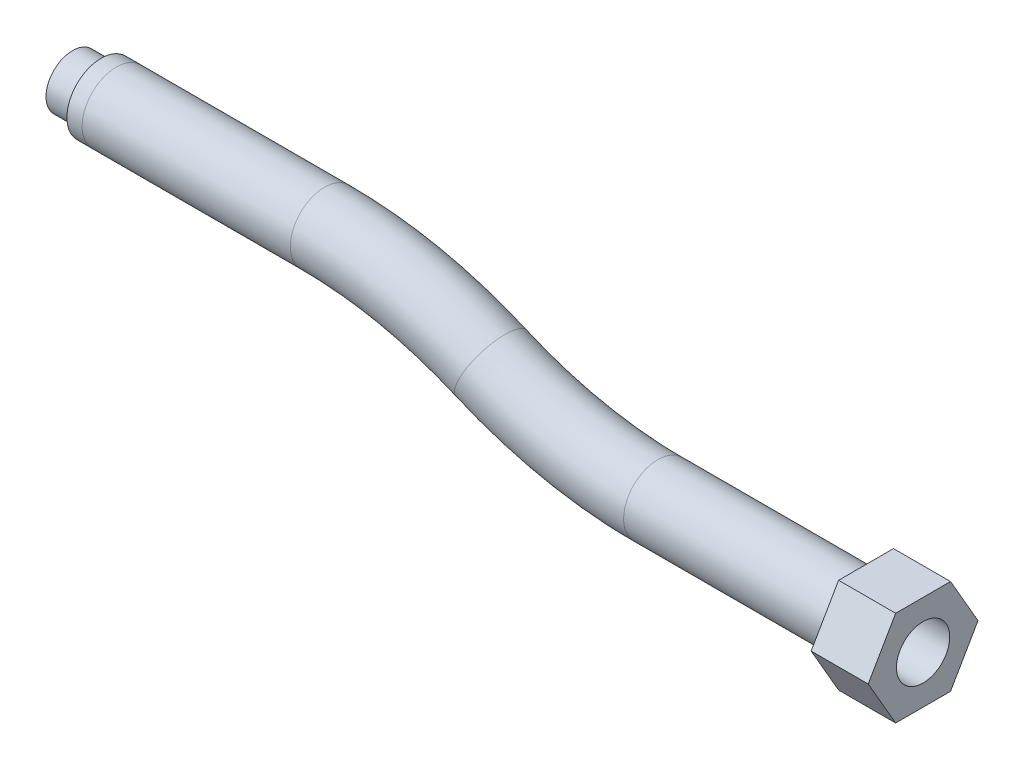
ISO-10303-21;
HEADER;
FILE_DESCRIPTION(('STEP AP214'),'2;1');
FILE_NAME('part.step','',(''),(''),'','','');
FILE_SCHEMA(('AUTOMOTIVE_DESIGN { 1 0 10303 214 1 1 1 1 }'));
ENDSEC;
DATA;
#1=APPLICATION_CONTEXT('core data for automotive mechanical design processes');
#2=APPLICATION_PROTOCOL_DEFINITION('international standard','automotive_design',2000,#1);
#3=PRODUCT_CONTEXT('',#1,'mechanical');
#4=PRODUCT('Part','Part','',(#3));
#5=PRODUCT_RELATED_PRODUCT_CATEGORY('part','',(#4));
#6=PRODUCT_DEFINITION_FORMATION('','',#4);
#7=PRODUCT_DEFINITION_CONTEXT('part definition',#1,'design');
#8=PRODUCT_DEFINITION('design','',#6,#7);
#9=PRODUCT_DEFINITION_SHAPE('','',#8);
#10=(LENGTH_UNIT() NAMED_UNIT(*) SI_UNIT(.MILLI.,.METRE.));
#11=(NAMED_UNIT(*) PLANE_ANGLE_UNIT() SI_UNIT($,.RADIAN.));
#12=(NAMED_UNIT(*) SI_UNIT($,.STERADIAN.) SOLID_ANGLE_UNIT());
#13=UNCERTAINTY_MEASURE_WITH_UNIT(LENGTH_MEASURE(1.E-05),#10,'distance_accuracy_value','');
#14=(GEOMETRIC_REPRESENTATION_CONTEXT(3) GLOBAL_UNCERTAINTY_ASSIGNED_CONTEXT((#13)) GLOBAL_UNIT_ASSIGNED_CONTEXT((#10,
#11,#12)) REPRESENTATION_CONTEXT('',''));
#15=CARTESIAN_POINT('',(0.,0.,0.));
#16=DIRECTION('',(0.,0.,1.));
#17=DIRECTION('',(1.,0.,0.));
#18=AXIS2_PLACEMENT_3D('',#15,#16,#17);
#19=CARTESIAN_POINT('',(-255.37474378357,23.1140000000069,1.67389225676739E-11));
#20=DIRECTION('',(-1.,0.,0.));
#21=DIRECTION('',(0.,-1.,0.));
#22=AXIS2_PLACEMENT_3D('',#19,#20,#21);
#23=PLANE('',#22);
#24=CARTESIAN_POINT('',(-255.37474378357,23.1140000000069,1.67389225676739E-11));
#25=DIRECTION('',(-1.,0.,0.));
#26=DIRECTION('',(0.,-1.,0.));
#27=AXIS2_PLACEMENT_3D('',#24,#25,#26);
#28=CIRCLE('',#27,11.43);
#29=CARTESIAN_POINT('',(-255.37474378357,11.6840000000069,1.67389225676739E-11));
#30=VERTEX_POINT('',#29);
#31=EDGE_CURVE('E177',#30,#30,#28,.T.);
#32=ORIENTED_EDGE('',*,*,#31,.T.);
#33=EDGE_LOOP('',(#32));
#34=FACE_BOUND('',#33,.T.);
#35=CARTESIAN_POINT('',(-255.37474378357,23.1140000000069,1.67385767025729E-11));
#36=DIRECTION('',(-1.,0.,0.));
#37=DIRECTION('',(0.,-1.,0.));
#38=AXIS2_PLACEMENT_3D('',#35,#36,#37);
#39=CIRCLE('',#38,8.89);
#40=CARTESIAN_POINT('',(-255.37474378357,32.0040000000069,1.67385767025729E-11));
#41=VERTEX_POINT('',#40);
#42=EDGE_CURVE('E275',#41,#41,#39,.T.);
#43=ORIENTED_EDGE('',*,*,#42,.F.);
#44=EDGE_LOOP('',(#43));
#45=FACE_BOUND('',#44,.T.);
#46=ADVANCED_FACE('F53',(#34,#45),#23,.T.);
#47=CARTESIAN_POINT('',(0.,0.,0.));
#48=DIRECTION('',(-1.,0.,0.));
#49=DIRECTION('',(0.,-1.,0.));
#50=AXIS2_PLACEMENT_3D('',#47,#48,#49);
#51=PLANE('',#50);
#52=CARTESIAN_POINT('',(0.,0.,0.));
#53=DIRECTION('',(-1.,0.,0.));
#54=DIRECTION('',(0.,-1.,0.));
#55=AXIS2_PLACEMENT_3D('',#52,#53,#54);
#56=CIRCLE('',#55,6.35);
#57=CARTESIAN_POINT('',(0.,-6.35,0.));
#58=VERTEX_POINT('',#57);
#59=EDGE_CURVE('E174',#58,#58,#56,.T.);
#60=ORIENTED_EDGE('',*,*,#59,.T.);
#61=EDGE_LOOP('',(#60));
#62=FACE_BOUND('',#61,.T.);
#63=CARTESIAN_POINT('',(0.,0.,0.));
#64=DIRECTION('',(1.,0.,0.));
#65=DIRECTION('',(0.,1.,0.));
#66=AXIS2_PLACEMENT_3D('',#63,#64,#65);
#67=CIRCLE('',#66,8.89000000000001);
#68=CARTESIAN_POINT('',(0.,-8.89000000000001,0.));
#69=VERTEX_POINT('',#68);
#70=EDGE_CURVE('E280',#69,#69,#67,.T.);
#71=ORIENTED_EDGE('',*,*,#70,.T.);
#72=EDGE_LOOP('',(#71));
#73=FACE_BOUND('',#72,.T.);
#74=ADVANCED_FACE('F193',(#62,#73),#51,.F.);
#75=CARTESIAN_POINT('',(-255.37474378357,23.1140000000069,1.67389225676739E-11));
#76=DIRECTION('',(1.,0.,0.));
#77=DIRECTION('',(0.,0.,-1.));
#78=AXIS2_PLACEMENT_3D('',#75,#76,#77);
#79=CYLINDRICAL_SURFACE('',#78,11.43);
#80=CARTESIAN_POINT('',(-250.29474378357,23.1140000000069,1.67385767025729E-11));
#81=DIRECTION('',(1.,0.,0.));
#82=DIRECTION('',(0.,0.,-1.));
#83=AXIS2_PLACEMENT_3D('',#80,#81,#82);
#84=CIRCLE('',#83,11.43);
#85=CARTESIAN_POINT('',(-250.29474378357,23.1140000000069,-11.4299999999833));
#86=VERTEX_POINT('',#85);
#87=EDGE_CURVE('E178',#86,#86,#84,.F.);
#88=ORIENTED_EDGE('',*,*,#87,.T.);
#89=EDGE_LOOP('',(#88));
#90=FACE_BOUND('',#89,.T.);
#91=ORIENTED_EDGE('',*,*,#31,.F.);
#92=EDGE_LOOP('',(#91));
#93=FACE_BOUND('',#92,.T.);
#94=ADVANCED_FACE('F190',(#90,#93),#79,.T.);
#95=CARTESIAN_POINT('',(-250.29474378357,23.1140000000069,1.67385767025729E-11));
#96=DIRECTION('',(1.,0.,0.));
#97=DIRECTION('',(0.,0.,-1.));
#98=AXIS2_PLACEMENT_3D('',#95,#96,#97);
#99=CYLINDRICAL_SURFACE('',#98,11.43);
#100=CARTESIAN_POINT('',(-180.784244116964,23.1140000000069,1.67385767025729E-11));
#101=DIRECTION('',(1.,0.,0.));
#102=DIRECTION('',(0.,0.,-1.));
#103=AXIS2_PLACEMENT_3D('',#100,#101,#102);
#104=CIRCLE('',#103,11.43);
#105=CARTESIAN_POINT('',(-180.784244116964,34.5440000000069,2.50137754106654E-11));
#106=VERTEX_POINT('',#105);
#107=EDGE_CURVE('E181',#106,#106,#104,.F.);
#108=ORIENTED_EDGE('',*,*,#107,.T.);
#109=EDGE_LOOP('',(#108));
#110=FACE_BOUND('',#109,.T.);
#111=ORIENTED_EDGE('',*,*,#87,.F.);
#112=EDGE_LOOP('',(#111));
#113=FACE_BOUND('',#112,.T.);
#114=ADVANCED_FACE('F192',(#110,#113),#99,.T.);
#115=CARTESIAN_POINT('',(-180.784244116964,-116.585999999993,-8.44027408407788E-11));
#116=DIRECTION('',(0.,7.23989388284551E-13,-1.));
#117=DIRECTION('',(0.,1.,7.23989388284551E-13));
#118=AXIS2_PLACEMENT_3D('',#115,#116,#117);
#119=TOROIDAL_SURFACE('',#118,139.7,11.43);
#120=CARTESIAN_POINT('',(-125.147371891785,11.5570000000034,8.37143134216591E-12));
#121=DIRECTION('',(-0.917272727272703,0.398259643702068,2.88335755822283E-13));
#122=DIRECTION('',(-0.398259643702068,-0.917272727272703,0.));
#123=AXIS2_PLACEMENT_3D('',#120,#121,#122);
#124=CIRCLE('',#123,11.43);
#125=CARTESIAN_POINT('',(-120.59526416427,22.0414272727304,1.59620454298614E-11));
#126=VERTEX_POINT('',#125);
#127=EDGE_CURVE('E63',#126,#126,#124,.T.);
#128=CARTESIAN_POINT('',(-180.784244116964,-116.585999999993,-8.44027408407788E-11));
#129=DIRECTION('',(0.,7.23989388284551E-13,-1.));
#130=DIRECTION('',(0.,1.,7.23989388284551E-13));
#131=AXIS2_PLACEMENT_3D('',#128,#129,#130);
#132=CIRCLE('',#131,151.13);
#133=EDGE_CURVE('',#106,#126,#132,.T.);
#134=ORIENTED_EDGE('',*,*,#107,.F.);
#135=ORIENTED_EDGE('',*,*,#127,.T.);
#136=ORIENTED_EDGE('',*,*,#133,.T.);
#137=ORIENTED_EDGE('',*,*,#133,.F.);
#138=EDGE_LOOP('',(#134,#136,#135,#137));
#139=FACE_BOUND('',#138,.T.);
#140=ADVANCED_FACE('F200',(#139),#119,.T.);
#141=CARTESIAN_POINT('',(-69.5104996666062,139.7,1.01120467135702E-10));
#142=DIRECTION('',(0.,-7.23790708430466E-13,1.));
#143=DIRECTION('',(0.,-1.,-7.23790708430466E-13));
#144=AXIS2_PLACEMENT_3D('',#141,#142,#143);
#145=TOROIDAL_SURFACE('',#144,139.7,11.43);
#146=CARTESIAN_POINT('',(-69.5104996666062,0.,0.));
#147=DIRECTION('',(-1.,0.,0.));
#148=DIRECTION('',(0.,0.,1.));
#149=AXIS2_PLACEMENT_3D('',#146,#147,#148);
#150=CIRCLE('',#149,11.43);
#151=CARTESIAN_POINT('',(-69.5104996666062,0.,11.43));
#152=VERTEX_POINT('',#151);
#153=EDGE_CURVE('E12',#152,#152,#150,.T.);
#154=ORIENTED_EDGE('',*,*,#153,.T.);
#155=EDGE_LOOP('',(#154));
#156=FACE_BOUND('',#155,.T.);
#157=ORIENTED_EDGE('',*,*,#127,.F.);
#158=EDGE_LOOP('',(#157));
#159=FACE_BOUND('',#158,.T.);
#160=ADVANCED_FACE('F395',(#156,#159),#145,.T.);
#161=CARTESIAN_POINT('',(-69.5104996666062,0.,0.));
#162=DIRECTION('',(1.,0.,0.));
#163=DIRECTION('',(0.,1.,0.));
#164=AXIS2_PLACEMENT_3D('',#161,#162,#163);
#165=CYLINDRICAL_SURFACE('',#164,11.43);
#166=CARTESIAN_POINT('',(0.,0.,0.));
#167=DIRECTION('',(-1.,0.,0.));
#168=DIRECTION('',(0.,-1.,0.));
#169=AXIS2_PLACEMENT_3D('',#166,#167,#168);
#170=CIRCLE('',#169,11.43);
#171=CARTESIAN_POINT('',(0.,-11.43,0.));
#172=VERTEX_POINT('',#171);
#173=EDGE_CURVE('E57',#172,#172,#170,.T.);
#174=ORIENTED_EDGE('',*,*,#173,.T.);
#175=EDGE_LOOP('',(#174));
#176=FACE_BOUND('',#175,.T.);
#177=ORIENTED_EDGE('',*,*,#153,.F.);
#178=EDGE_LOOP('',(#177));
#179=FACE_BOUND('',#178,.T.);
#180=ADVANCED_FACE('F55',(#176,#179),#165,.T.);
#181=CARTESIAN_POINT('',(-255.37474378357,23.1140000000069,1.67389225676739E-11));
#182=DIRECTION('',(1.,0.,0.));
#183=DIRECTION('',(0.,0.,-1.));
#184=AXIS2_PLACEMENT_3D('',#181,#182,#183);
#185=CYLINDRICAL_SURFACE('',#184,6.35);
#186=CARTESIAN_POINT('',(-250.29474378357,23.1140000000069,1.67385767025729E-11));
#187=DIRECTION('',(-1.,0.,0.));
#188=DIRECTION('',(0.,-1.,0.));
#189=AXIS2_PLACEMENT_3D('',#186,#187,#188);
#190=CIRCLE('',#189,6.35);
#191=CARTESIAN_POINT('',(-250.29474378357,16.7640000000069,1.67385767025729E-11));
#192=VERTEX_POINT('',#191);
#193=EDGE_CURVE('E162',#192,#192,#190,.T.);
#194=ORIENTED_EDGE('',*,*,#193,.F.);
#195=EDGE_LOOP('',(#194));
#196=FACE_BOUND('',#195,.T.);
#197=CARTESIAN_POINT('',(-264.89974378357,23.1140000000069,1.67389396773399E-11));
#198=DIRECTION('',(-1.,0.,0.));
#199=DIRECTION('',(0.,-1.,0.));
#200=AXIS2_PLACEMENT_3D('',#197,#198,#199);
#201=CIRCLE('',#200,6.35);
#202=CARTESIAN_POINT('',(-264.89974378357,16.7640000000069,1.67389396773399E-11));
#203=VERTEX_POINT('',#202);
#204=EDGE_CURVE('E273',#203,#203,#201,.T.);
#205=ORIENTED_EDGE('',*,*,#204,.T.);
#206=EDGE_LOOP('',(#205));
#207=FACE_BOUND('',#206,.T.);
#208=ADVANCED_FACE('F227',(#196,#207),#185,.F.);
#209=CARTESIAN_POINT('',(-250.29474378357,23.1140000000069,1.67385767025729E-11));
#210=DIRECTION('',(1.,0.,0.));
#211=DIRECTION('',(0.,0.,-1.));
#212=AXIS2_PLACEMENT_3D('',#209,#210,#211);
#213=CYLINDRICAL_SURFACE('',#212,6.35);
#214=CARTESIAN_POINT('',(-180.784244116964,23.1140000000069,1.67385767025729E-11));
#215=DIRECTION('',(-1.,0.,0.));
#216=DIRECTION('',(0.,-1.,0.));
#217=AXIS2_PLACEMENT_3D('',#214,#215,#216);
#218=CIRCLE('',#217,6.35);
#219=CARTESIAN_POINT('',(-180.784244116964,29.4640000000069,2.13359093181798E-11));
#220=VERTEX_POINT('',#219);
#221=EDGE_CURVE('E165',#220,#220,#218,.T.);
#222=ORIENTED_EDGE('',*,*,#221,.F.);
#223=EDGE_LOOP('',(#222));
#224=FACE_BOUND('',#223,.T.);
#225=ORIENTED_EDGE('',*,*,#193,.T.);
#226=EDGE_LOOP('',(#225));
#227=FACE_BOUND('',#226,.T.);
#228=ADVANCED_FACE('F223',(#224,#227),#213,.F.);
#229=CARTESIAN_POINT('',(-180.784244116964,-116.585999999993,-8.44027408407788E-11));
#230=DIRECTION('',(0.,7.23989388284551E-13,-1.));
#231=DIRECTION('',(0.,1.,7.23989388284551E-13));
#232=AXIS2_PLACEMENT_3D('',#229,#230,#231);
#233=TOROIDAL_SURFACE('',#232,139.7,6.35);
#234=CARTESIAN_POINT('',(-125.147371891785,11.5570000000034,8.3714313421659E-12));
#235=DIRECTION('',(-0.917272727272703,0.398259643702068,2.88335755822284E-13));
#236=DIRECTION('',(-0.398259643702068,-0.917272727272703,0.));
#237=AXIS2_PLACEMENT_3D('',#234,#235,#236);
#238=CIRCLE('',#237,6.35);
#239=CARTESIAN_POINT('',(-122.618423154277,17.3816818181851,1.25884391686634E-11));
#240=VERTEX_POINT('',#239);
#241=EDGE_CURVE('E168',#240,#240,#238,.T.);
#242=CARTESIAN_POINT('',(-180.784244116964,-116.585999999993,-8.44027408407788E-11));
#243=DIRECTION('',(0.,7.23989388284551E-13,-1.));
#244=DIRECTION('',(0.,1.,7.23989388284551E-13));
#245=AXIS2_PLACEMENT_3D('',#242,#243,#244);
#246=CIRCLE('',#245,146.05);
#247=EDGE_CURVE('',#220,#240,#246,.T.);
#248=ORIENTED_EDGE('',*,*,#221,.T.);
#249=ORIENTED_EDGE('',*,*,#241,.F.);
#250=ORIENTED_EDGE('',*,*,#247,.T.);
#251=ORIENTED_EDGE('',*,*,#247,.F.);
#252=EDGE_LOOP('',(#248,#250,#249,#251));
#253=FACE_BOUND('',#252,.T.);
#254=ADVANCED_FACE('F219',(#253),#233,.F.);
#255=CARTESIAN_POINT('',(-69.5104996666062,139.7,1.01120467135702E-10));
#256=DIRECTION('',(0.,-7.23790708430466E-13,1.));
#257=DIRECTION('',(0.,-1.,-7.23790708430466E-13));
#258=AXIS2_PLACEMENT_3D('',#255,#256,#257);
#259=TOROIDAL_SURFACE('',#258,139.7,6.35);
#260=CARTESIAN_POINT('',(-69.5104996666062,0.,0.));
#261=DIRECTION('',(-1.,0.,0.));
#262=DIRECTION('',(0.,-1.,0.));
#263=AXIS2_PLACEMENT_3D('',#260,#261,#262);
#264=CIRCLE('',#263,6.35);
#265=CARTESIAN_POINT('',(-69.5104996666062,-6.35,0.));
#266=VERTEX_POINT('',#265);
#267=EDGE_CURVE('E171',#266,#266,#264,.T.);
#268=ORIENTED_EDGE('',*,*,#267,.F.);
#269=EDGE_LOOP('',(#268));
#270=FACE_BOUND('',#269,.T.);
#271=ORIENTED_EDGE('',*,*,#241,.T.);
#272=EDGE_LOOP('',(#271));
#273=FACE_BOUND('',#272,.T.);
#274=ADVANCED_FACE('F208',(#270,#273),#259,.F.);
#275=CARTESIAN_POINT('',(-69.5104996666062,0.,0.));
#276=DIRECTION('',(1.,0.,0.));
#277=DIRECTION('',(0.,1.,0.));
#278=AXIS2_PLACEMENT_3D('',#275,#276,#277);
#279=CYLINDRICAL_SURFACE('',#278,6.35);
#280=ORIENTED_EDGE('',*,*,#59,.F.);
#281=EDGE_LOOP('',(#280));
#282=FACE_BOUND('',#281,.T.);
#283=ORIENTED_EDGE('',*,*,#267,.T.);
#284=EDGE_LOOP('',(#283));
#285=FACE_BOUND('',#284,.T.);
#286=ADVANCED_FACE('F196',(#282,#285),#279,.F.);
#287=CARTESIAN_POINT('',(19.05,0.,0.));
#288=DIRECTION('',(1.,0.,0.));
#289=DIRECTION('',(0.,1.,0.));
#290=AXIS2_PLACEMENT_3D('',#287,#288,#289);
#291=PLANE('',#290);
#292=DIRECTION('',(0.,0.866025403784439,0.5));
#293=VECTOR('',#292,1.);
#294=CARTESIAN_POINT('',(19.05,0.,-18.3308710467706));
#295=LINE('',#294,#293);
#296=CARTESIAN_POINT('',(19.05,0.,-18.3308710467706));
#297=VERTEX_POINT('',#296);
#298=CARTESIAN_POINT('',(19.05,15.875,-9.1654355233853));
#299=VERTEX_POINT('',#298);
#300=EDGE_CURVE('E153',#297,#299,#295,.T.);
#301=ORIENTED_EDGE('',*,*,#300,.T.);
#302=DIRECTION('',(0.,0.,1.));
#303=VECTOR('',#302,1.);
#304=CARTESIAN_POINT('',(19.05,15.875,-9.1654355233853));
#305=LINE('',#304,#303);
#306=CARTESIAN_POINT('',(19.05,15.875,9.16543552338531));
#307=VERTEX_POINT('',#306);
#308=EDGE_CURVE('E110',#299,#307,#305,.T.);
#309=ORIENTED_EDGE('',*,*,#308,.T.);
#310=DIRECTION('',(0.,-0.866025403784439,0.5));
#311=VECTOR('',#310,1.);
#312=CARTESIAN_POINT('',(19.05,15.875,9.16543552338531));
#313=LINE('',#312,#311);
#314=CARTESIAN_POINT('',(19.05,0.,18.3308710467706));
#315=VERTEX_POINT('',#314);
#316=EDGE_CURVE('E124',#307,#315,#313,.T.);
#317=ORIENTED_EDGE('',*,*,#316,.T.);
#318=DIRECTION('',(0.,-0.866025403784438,-0.5));
#319=VECTOR('',#318,1.);
#320=CARTESIAN_POINT('',(19.05,0.,18.3308710467706));
#321=LINE('',#320,#319);
#322=CARTESIAN_POINT('',(19.05,-15.875,9.16543552338531));
#323=VERTEX_POINT('',#322);
#324=EDGE_CURVE('E117',#315,#323,#321,.T.);
#325=ORIENTED_EDGE('',*,*,#324,.T.);
#326=DIRECTION('',(0.,0.,-1.));
#327=VECTOR('',#326,1.);
#328=CARTESIAN_POINT('',(19.05,-15.875,9.16543552338531));
#329=LINE('',#328,#327);
#330=CARTESIAN_POINT('',(19.05,-15.875,-9.16543552338531));
#331=VERTEX_POINT('',#330);
#332=EDGE_CURVE('E122',#323,#331,#329,.T.);
#333=ORIENTED_EDGE('',*,*,#332,.T.);
#334=DIRECTION('',(0.,0.866025403784438,-0.5));
#335=VECTOR('',#334,1.);
#336=CARTESIAN_POINT('',(19.05,-15.875,-9.16543552338531));
#337=LINE('',#336,#335);
#338=EDGE_CURVE('E72',#331,#297,#337,.T.);
#339=ORIENTED_EDGE('',*,*,#338,.T.);
#340=EDGE_LOOP('',(#301,#309,#317,#325,#333,#339));
#341=FACE_BOUND('',#340,.T.);
#342=CARTESIAN_POINT('',(19.05,0.,0.));
#343=DIRECTION('',(1.,0.,0.));
#344=DIRECTION('',(0.,1.,0.));
#345=AXIS2_PLACEMENT_3D('',#342,#343,#344);
#346=CIRCLE('',#345,8.89000000000001);
#347=CARTESIAN_POINT('',(19.05,-8.89000000000001,0.));
#348=VERTEX_POINT('',#347);
#349=EDGE_CURVE('E146',#348,#348,#346,.T.);
#350=ORIENTED_EDGE('',*,*,#349,.F.);
#351=EDGE_LOOP('',(#350));
#352=FACE_BOUND('',#351,.T.);
#353=ADVANCED_FACE('F119',(#341,#352),#291,.T.);
#354=CARTESIAN_POINT('',(0.,0.,0.));
#355=DIRECTION('',(1.,0.,0.));
#356=DIRECTION('',(0.,1.,0.));
#357=AXIS2_PLACEMENT_3D('',#354,#355,#356);
#358=PLANE('',#357);
#359=ORIENTED_EDGE('',*,*,#173,.F.);
#360=EDGE_LOOP('',(#359));
#361=FACE_BOUND('',#360,.T.);
#362=DIRECTION('',(0.,0.866025403784439,0.5));
#363=VECTOR('',#362,1.);
#364=CARTESIAN_POINT('',(0.,0.,-18.3308710467706));
#365=LINE('',#364,#363);
#366=CARTESIAN_POINT('',(0.,0.,-18.3308710467706));
#367=VERTEX_POINT('',#366);
#368=CARTESIAN_POINT('',(0.,15.875,-9.1654355233853));
#369=VERTEX_POINT('',#368);
#370=EDGE_CURVE('E142',#367,#369,#365,.T.);
#371=ORIENTED_EDGE('',*,*,#370,.F.);
#372=DIRECTION('',(0.,0.866025403784438,-0.5));
#373=VECTOR('',#372,1.);
#374=CARTESIAN_POINT('',(0.,-15.875,-9.16543552338531));
#375=LINE('',#374,#373);
#376=CARTESIAN_POINT('',(0.,-15.875,-9.16543552338531));
#377=VERTEX_POINT('',#376);
#378=EDGE_CURVE('E101',#377,#367,#375,.T.);
#379=ORIENTED_EDGE('',*,*,#378,.F.);
#380=DIRECTION('',(0.,0.,-1.));
#381=VECTOR('',#380,1.);
#382=CARTESIAN_POINT('',(0.,-15.875,9.16543552338531));
#383=LINE('',#382,#381);
#384=CARTESIAN_POINT('',(0.,-15.875,9.16543552338531));
#385=VERTEX_POINT('',#384);
#386=EDGE_CURVE('E95',#385,#377,#383,.T.);
#387=ORIENTED_EDGE('',*,*,#386,.F.);
#388=DIRECTION('',(0.,-0.866025403784438,-0.5));
#389=VECTOR('',#388,1.);
#390=CARTESIAN_POINT('',(0.,0.,18.3308710467706));
#391=LINE('',#390,#389);
#392=CARTESIAN_POINT('',(0.,0.,18.3308710467706));
#393=VERTEX_POINT('',#392);
#394=EDGE_CURVE('E132',#393,#385,#391,.T.);
#395=ORIENTED_EDGE('',*,*,#394,.F.);
#396=DIRECTION('',(0.,-0.866025403784439,0.5));
#397=VECTOR('',#396,1.);
#398=CARTESIAN_POINT('',(0.,15.875,9.16543552338531));
#399=LINE('',#398,#397);
#400=CARTESIAN_POINT('',(0.,15.875,9.16543552338531));
#401=VERTEX_POINT('',#400);
#402=EDGE_CURVE('E148',#401,#393,#399,.T.);
#403=ORIENTED_EDGE('',*,*,#402,.F.);
#404=DIRECTION('',(0.,0.,1.));
#405=VECTOR('',#404,1.);
#406=CARTESIAN_POINT('',(0.,15.875,-9.1654355233853));
#407=LINE('',#406,#405);
#408=EDGE_CURVE('E145',#369,#401,#407,.T.);
#409=ORIENTED_EDGE('',*,*,#408,.F.);
#410=EDGE_LOOP('',(#371,#379,#387,#395,#403,#409));
#411=FACE_BOUND('',#410,.T.);
#412=ADVANCED_FACE('F235',(#361,#411),#358,.F.);
#413=CARTESIAN_POINT('',(19.05,0.,-18.3308710467706));
#414=DIRECTION('',(0.,-0.5,0.866025403784439));
#415=DIRECTION('',(0.,-0.866025403784438,-0.5));
#416=AXIS2_PLACEMENT_3D('',#413,#414,#415);
#417=PLANE('',#416);
#418=ORIENTED_EDGE('',*,*,#370,.T.);
#419=DIRECTION('',(-1.,0.,0.));
#420=VECTOR('',#419,1.);
#421=CARTESIAN_POINT('',(19.05,15.875,-9.1654355233853));
#422=LINE('',#421,#420);
#423=EDGE_CURVE('E160',#299,#369,#422,.T.);
#424=ORIENTED_EDGE('',*,*,#423,.F.);
#425=ORIENTED_EDGE('',*,*,#300,.F.);
#426=DIRECTION('',(-1.,0.,0.));
#427=VECTOR('',#426,1.);
#428=CARTESIAN_POINT('',(19.05,0.,-18.3308710467706));
#429=LINE('',#428,#427);
#430=EDGE_CURVE('E138',#297,#367,#429,.T.);
#431=ORIENTED_EDGE('',*,*,#430,.T.);
#432=EDGE_LOOP('',(#418,#424,#425,#431));
#433=FACE_BOUND('',#432,.T.);
#434=ADVANCED_FACE('F231',(#433),#417,.F.);
#435=CARTESIAN_POINT('',(19.05,15.875,-9.1654355233853));
#436=DIRECTION('',(0.,-1.,0.));
#437=DIRECTION('',(1.,0.,0.));
#438=AXIS2_PLACEMENT_3D('',#435,#436,#437);
#439=PLANE('',#438);
#440=ORIENTED_EDGE('',*,*,#408,.T.);
#441=DIRECTION('',(-1.,0.,0.));
#442=VECTOR('',#441,1.);
#443=CARTESIAN_POINT('',(19.05,15.875,9.16543552338531));
#444=LINE('',#443,#442);
#445=EDGE_CURVE('E157',#307,#401,#444,.T.);
#446=ORIENTED_EDGE('',*,*,#445,.F.);
#447=ORIENTED_EDGE('',*,*,#308,.F.);
#448=ORIENTED_EDGE('',*,*,#423,.T.);
#449=EDGE_LOOP('',(#440,#446,#447,#448));
#450=FACE_BOUND('',#449,.T.);
#451=ADVANCED_FACE('F234',(#450),#439,.F.);
#452=CARTESIAN_POINT('',(19.05,15.875,9.16543552338531));
#453=DIRECTION('',(0.,-0.5,-0.866025403784439));
#454=DIRECTION('',(0.,0.866025403784438,-0.5));
#455=AXIS2_PLACEMENT_3D('',#452,#453,#454);
#456=PLANE('',#455);
#457=ORIENTED_EDGE('',*,*,#402,.T.);
#458=DIRECTION('',(-1.,0.,0.));
#459=VECTOR('',#458,1.);
#460=CARTESIAN_POINT('',(19.05,0.,18.3308710467706));
#461=LINE('',#460,#459);
#462=EDGE_CURVE('E133',#315,#393,#461,.T.);
#463=ORIENTED_EDGE('',*,*,#462,.F.);
#464=ORIENTED_EDGE('',*,*,#316,.F.);
#465=ORIENTED_EDGE('',*,*,#445,.T.);
#466=EDGE_LOOP('',(#457,#463,#464,#465));
#467=FACE_BOUND('',#466,.T.);
#468=ADVANCED_FACE('F239',(#467),#456,.F.);
#469=CARTESIAN_POINT('',(19.05,0.,18.3308710467706));
#470=DIRECTION('',(0.,0.5,-0.866025403784439));
#471=DIRECTION('',(0.,0.866025403784438,0.5));
#472=AXIS2_PLACEMENT_3D('',#469,#470,#471);
#473=PLANE('',#472);
#474=ORIENTED_EDGE('',*,*,#394,.T.);
#475=DIRECTION('',(-1.,0.,0.));
#476=VECTOR('',#475,1.);
#477=CARTESIAN_POINT('',(19.05,-15.875,9.16543552338531));
#478=LINE('',#477,#476);
#479=EDGE_CURVE('E129',#323,#385,#478,.T.);
#480=ORIENTED_EDGE('',*,*,#479,.F.);
#481=ORIENTED_EDGE('',*,*,#324,.F.);
#482=ORIENTED_EDGE('',*,*,#462,.T.);
#483=EDGE_LOOP('',(#474,#480,#481,#482));
#484=FACE_BOUND('',#483,.T.);
#485=ADVANCED_FACE('F130',(#484),#473,.F.);
#486=CARTESIAN_POINT('',(19.05,-15.875,9.16543552338531));
#487=DIRECTION('',(0.,1.,0.));
#488=DIRECTION('',(-1.,0.,0.));
#489=AXIS2_PLACEMENT_3D('',#486,#487,#488);
#490=PLANE('',#489);
#491=ORIENTED_EDGE('',*,*,#386,.T.);
#492=DIRECTION('',(-1.,0.,0.));
#493=VECTOR('',#492,1.);
#494=CARTESIAN_POINT('',(19.05,-15.875,-9.16543552338531));
#495=LINE('',#494,#493);
#496=EDGE_CURVE('E134',#331,#377,#495,.T.);
#497=ORIENTED_EDGE('',*,*,#496,.F.);
#498=ORIENTED_EDGE('',*,*,#332,.F.);
#499=ORIENTED_EDGE('',*,*,#479,.T.);
#500=EDGE_LOOP('',(#491,#497,#498,#499));
#501=FACE_BOUND('',#500,.T.);
#502=ADVANCED_FACE('F136',(#501),#490,.F.);
#503=CARTESIAN_POINT('',(19.05,-15.875,-9.16543552338531));
#504=DIRECTION('',(0.,0.5,0.866025403784439));
#505=DIRECTION('',(0.,-0.866025403784438,0.5));
#506=AXIS2_PLACEMENT_3D('',#503,#504,#505);
#507=PLANE('',#506);
#508=ORIENTED_EDGE('',*,*,#378,.T.);
#509=ORIENTED_EDGE('',*,*,#430,.F.);
#510=ORIENTED_EDGE('',*,*,#338,.F.);
#511=ORIENTED_EDGE('',*,*,#496,.T.);
#512=EDGE_LOOP('',(#508,#509,#510,#511));
#513=FACE_BOUND('',#512,.T.);
#514=ADVANCED_FACE('F247',(#513),#507,.F.);
#515=CARTESIAN_POINT('',(19.05,0.,0.));
#516=DIRECTION('',(-1.,0.,0.));
#517=DIRECTION('',(0.,-1.,0.));
#518=AXIS2_PLACEMENT_3D('',#515,#516,#517);
#519=CYLINDRICAL_SURFACE('',#518,8.89000000000001);
#520=CARTESIAN_POINT('',(19.05,-8.89000000000001,0.));
#521=CARTESIAN_POINT('',(18.8515625,-8.89000000000001,0.));
#522=CARTESIAN_POINT('',(18.653125,-8.89000000000001,0.));
#523=CARTESIAN_POINT('',(18.25625,-8.89000000000001,0.));
#524=CARTESIAN_POINT('',(18.0578125,-8.89000000000001,0.));
#525=CARTESIAN_POINT('',(17.6609375,-8.89000000000001,0.));
#526=CARTESIAN_POINT('',(17.4625,-8.89000000000001,0.));
#527=CARTESIAN_POINT('',(17.065625,-8.89000000000001,0.));
#528=CARTESIAN_POINT('',(16.8671875,-8.89000000000001,0.));
#529=CARTESIAN_POINT('',(16.4703125,-8.89000000000001,0.));
#530=CARTESIAN_POINT('',(16.271875,-8.89000000000001,0.));
#531=CARTESIAN_POINT('',(15.875,-8.89000000000001,0.));
#532=CARTESIAN_POINT('',(15.6765625,-8.89000000000001,0.));
#533=CARTESIAN_POINT('',(15.2796875,-8.89000000000001,0.));
#534=CARTESIAN_POINT('',(15.08125,-8.89000000000001,0.));
#535=CARTESIAN_POINT('',(14.684375,-8.89000000000001,0.));
#536=CARTESIAN_POINT('',(14.4859375,-8.89000000000001,0.));
#537=CARTESIAN_POINT('',(14.0890625,-8.89000000000001,0.));
#538=CARTESIAN_POINT('',(13.890625,-8.89000000000001,0.));
#539=CARTESIAN_POINT('',(13.49375,-8.89000000000001,0.));
#540=CARTESIAN_POINT('',(13.2953125,-8.89000000000001,0.));
#541=CARTESIAN_POINT('',(12.8984375,-8.89000000000001,0.));
#542=CARTESIAN_POINT('',(12.7,-8.89000000000001,0.));
#543=CARTESIAN_POINT('',(12.303125,-8.89000000000001,0.));
#544=CARTESIAN_POINT('',(12.1046875,-8.89000000000001,0.));
#545=CARTESIAN_POINT('',(11.7078125,-8.89000000000001,0.));
#546=CARTESIAN_POINT('',(11.509375,-8.89000000000001,0.));
#547=CARTESIAN_POINT('',(11.1125,-8.89000000000001,0.));
#548=CARTESIAN_POINT('',(10.9140625,-8.89000000000001,0.));
#549=CARTESIAN_POINT('',(10.5171875,-8.89000000000001,0.));
#550=CARTESIAN_POINT('',(10.31875,-8.89000000000001,0.));
#551=CARTESIAN_POINT('',(9.921875,-8.89000000000001,0.));
#552=CARTESIAN_POINT('',(9.7234375,-8.89000000000001,0.));
#553=CARTESIAN_POINT('',(9.3265625,-8.89000000000001,0.));
#554=CARTESIAN_POINT('',(9.128125,-8.89000000000001,0.));
#555=CARTESIAN_POINT('',(8.73125,-8.89000000000001,0.));
#556=CARTESIAN_POINT('',(8.5328125,-8.89000000000001,0.));
#557=CARTESIAN_POINT('',(8.1359375,-8.89000000000001,0.));
#558=CARTESIAN_POINT('',(7.9375,-8.89000000000001,0.));
#559=CARTESIAN_POINT('',(7.540625,-8.89000000000001,0.));
#560=CARTESIAN_POINT('',(7.3421875,-8.89000000000001,0.));
#561=CARTESIAN_POINT('',(6.9453125,-8.89000000000001,0.));
#562=CARTESIAN_POINT('',(6.746875,-8.89000000000001,0.));
#563=CARTESIAN_POINT('',(6.35,-8.89000000000001,0.));
#564=CARTESIAN_POINT('',(6.1515625,-8.89000000000001,0.));
#565=CARTESIAN_POINT('',(5.7546875,-8.89000000000001,0.));
#566=CARTESIAN_POINT('',(5.55625,-8.89000000000001,0.));
#567=CARTESIAN_POINT('',(5.159375,-8.89000000000001,0.));
#568=CARTESIAN_POINT('',(4.9609375,-8.89000000000001,0.));
#569=CARTESIAN_POINT('',(4.5640625,-8.89000000000001,0.));
#570=CARTESIAN_POINT('',(4.365625,-8.89000000000001,0.));
#571=CARTESIAN_POINT('',(3.96875,-8.89000000000001,0.));
#572=CARTESIAN_POINT('',(3.7703125,-8.89000000000001,0.));
#573=CARTESIAN_POINT('',(3.3734375,-8.89000000000001,0.));
#574=CARTESIAN_POINT('',(3.175,-8.89000000000001,0.));
#575=CARTESIAN_POINT('',(2.778125,-8.89000000000001,0.));
#576=CARTESIAN_POINT('',(2.5796875,-8.89000000000001,0.));
#577=CARTESIAN_POINT('',(2.1828125,-8.89000000000001,0.));
#578=CARTESIAN_POINT('',(1.984375,-8.89000000000001,0.));
#579=CARTESIAN_POINT('',(1.5875,-8.89000000000001,0.));
#580=CARTESIAN_POINT('',(1.3890625,-8.89000000000001,0.));
#581=CARTESIAN_POINT('',(0.992187500000001,-8.89000000000001,0.));
#582=CARTESIAN_POINT('',(0.793750000000001,-8.89000000000001,0.));
#583=CARTESIAN_POINT('',(0.396875,-8.89000000000001,0.));
#584=CARTESIAN_POINT('',(0.1984375,-8.89000000000001,0.));
#585=CARTESIAN_POINT('',(0.,-8.89000000000001,0.));
#586=B_SPLINE_CURVE_WITH_KNOTS('',3,(#520,#521,#522,#523,#524,#525,#526,#527,#528,#529,#530,
#531,#532,#533,#534,#535,#536,#537,#538,#539,#540,#541,#542,#543,#544,#545,#546,#547,#548,#549,
#550,#551,#552,#553,#554,#555,#556,#557,#558,#559,#560,#561,#562,#563,#564,#565,#566,#567,#568,
#569,#570,#571,#572,#573,#574,#575,#576,#577,#578,#579,#580,#581,#582,#583,#584,#585),
.UNSPECIFIED.,.F.,.F.,(4,2,2,2,2,2,2,2,2,2,2,2,2,2,2,2,2,2,2,2,2,2,2,2,2,2,2,2,2,2,2,2,4),(0.,
0.5953125,1.190625,1.7859375,2.38125,2.9765625,3.571875,4.1671875,4.7625,5.3578125,5.953125,
6.5484375,7.14375,7.7390625,8.334375,8.9296875,9.525,10.1203125,10.715625,11.3109375,11.90625,
12.5015625,13.096875,13.6921875,14.2875,14.8828125,15.478125,16.0734375,16.66875,17.2640625,
17.859375,18.4546875,19.05),.UNSPECIFIED.);
#587=EDGE_CURVE('BSEAM250',#348,#69,#586,.T.);
#588=ORIENTED_EDGE('',*,*,#349,.T.);
#589=ORIENTED_EDGE('',*,*,#70,.F.);
#590=ORIENTED_EDGE('',*,*,#587,.T.);
#591=ORIENTED_EDGE('',*,*,#587,.F.);
#592=EDGE_LOOP('',(#588,#590,#589,#591));
#593=FACE_BOUND('',#592,.T.);
#594=ADVANCED_FACE('F250',(#593),#519,.F.);
#595=CARTESIAN_POINT('',(-264.89974378357,23.1140000000069,1.67389396773399E-11));
#596=DIRECTION('',(-1.,0.,0.));
#597=DIRECTION('',(0.,-1.,0.));
#598=AXIS2_PLACEMENT_3D('',#595,#596,#597);
#599=PLANE('',#598);
#600=CARTESIAN_POINT('',(-264.89974378357,23.1140000000069,1.67389396773399E-11));
#601=DIRECTION('',(-1.,0.,0.));
#602=DIRECTION('',(0.,-1.,0.));
#603=AXIS2_PLACEMENT_3D('',#600,#601,#602);
#604=CIRCLE('',#603,8.89);
#605=CARTESIAN_POINT('',(-264.89974378357,32.0040000000069,1.67389396773399E-11));
#606=VERTEX_POINT('',#605);
#607=EDGE_CURVE('E270',#606,#606,#604,.T.);
#608=ORIENTED_EDGE('',*,*,#607,.T.);
#609=EDGE_LOOP('',(#608));
#610=FACE_BOUND('',#609,.T.);
#611=ORIENTED_EDGE('',*,*,#204,.F.);
#612=EDGE_LOOP('',(#611));
#613=FACE_BOUND('',#612,.T.);
#614=ADVANCED_FACE('F257',(#610,#613),#599,.T.);
#615=CARTESIAN_POINT('',(-264.89974378357,23.1140000000069,1.67389396773399E-11));
#616=DIRECTION('',(1.,0.,0.));
#617=DIRECTION('',(0.,1.,0.));
#618=AXIS2_PLACEMENT_3D('',#615,#616,#617);
#619=CYLINDRICAL_SURFACE('',#618,8.89);
#620=CARTESIAN_POINT('',(-264.89974378357,32.0040000000069,1.67389396773399E-11));
#621=CARTESIAN_POINT('',(-264.80052503357,32.0040000000069,1.67389358963528E-11));
#622=CARTESIAN_POINT('',(-264.70130628357,32.0040000000069,1.67389321153656E-11));
#623=CARTESIAN_POINT('',(-264.50286878357,32.0040000000069,1.67389245533913E-11));
#624=CARTESIAN_POINT('',(-264.40365003357,32.0040000000069,1.67389207724041E-11));
#625=CARTESIAN_POINT('',(-264.20521253357,32.0040000000069,1.67389132104298E-11));
#626=CARTESIAN_POINT('',(-264.10599378357,32.0040000000069,1.67389094294427E-11));
#627=CARTESIAN_POINT('',(-263.90755628357,32.0040000000069,1.67389018674684E-11));
#628=CARTESIAN_POINT('',(-263.80833753357,32.0040000000069,1.67388980864812E-11));
#629=CARTESIAN_POINT('',(-263.60990003357,32.0040000000069,1.67388905245069E-11));
#630=CARTESIAN_POINT('',(-263.51068128357,32.0040000000069,1.67388867435197E-11));
#631=CARTESIAN_POINT('',(-263.31224378357,32.0040000000069,1.67388791815454E-11));
#632=CARTESIAN_POINT('',(-263.21302503357,32.0040000000069,1.67388754005583E-11));
#633=CARTESIAN_POINT('',(-263.01458753357,32.0040000000069,1.6738867838584E-11));
#634=CARTESIAN_POINT('',(-262.91536878357,32.0040000000069,1.67388640575968E-11));
#635=CARTESIAN_POINT('',(-262.71693128357,32.0040000000069,1.67388564956225E-11));
#636=CARTESIAN_POINT('',(-262.61771253357,32.0040000000069,1.67388527146353E-11));
#637=CARTESIAN_POINT('',(-262.41927503357,32.0040000000069,1.6738845152661E-11));
#638=CARTESIAN_POINT('',(-262.32005628357,32.0040000000069,1.67388413716739E-11));
#639=CARTESIAN_POINT('',(-262.12161878357,32.0040000000069,1.67388338096996E-11));
#640=CARTESIAN_POINT('',(-262.02240003357,32.0040000000069,1.67388300287124E-11));
#641=CARTESIAN_POINT('',(-261.82396253357,32.0040000000069,1.67388224667381E-11));
#642=CARTESIAN_POINT('',(-261.72474378357,32.0040000000069,1.67388186857509E-11));
#643=CARTESIAN_POINT('',(-261.52630628357,32.0040000000069,1.67388111237766E-11));
#644=CARTESIAN_POINT('',(-261.42708753357,32.0040000000069,1.67388073427895E-11));
#645=CARTESIAN_POINT('',(-261.22865003357,32.0040000000069,1.67387997808152E-11));
#646=CARTESIAN_POINT('',(-261.12943128357,32.0040000000069,1.6738795999828E-11));
#647=CARTESIAN_POINT('',(-260.93099378357,32.0040000000069,1.67387884378537E-11));
#648=CARTESIAN_POINT('',(-260.83177503357,32.0040000000069,1.67387846568665E-11));
#649=CARTESIAN_POINT('',(-260.63333753357,32.0040000000069,1.67387770948922E-11));
#650=CARTESIAN_POINT('',(-260.53411878357,32.0040000000069,1.67387733139051E-11));
#651=CARTESIAN_POINT('',(-260.33568128357,32.0040000000069,1.67387657519307E-11));
#652=CARTESIAN_POINT('',(-260.23646253357,32.0040000000069,1.67387619709436E-11));
#653=CARTESIAN_POINT('',(-260.03802503357,32.0040000000069,1.67387544089693E-11));
#654=CARTESIAN_POINT('',(-259.93880628357,32.0040000000069,1.67387506279821E-11));
#655=CARTESIAN_POINT('',(-259.74036878357,32.0040000000069,1.67387430660078E-11));
#656=CARTESIAN_POINT('',(-259.64115003357,32.0040000000069,1.67387392850207E-11));
#657=CARTESIAN_POINT('',(-259.44271253357,32.0040000000069,1.67387317230463E-11));
#658=CARTESIAN_POINT('',(-259.34349378357,32.0040000000069,1.67387279420592E-11));
#659=CARTESIAN_POINT('',(-259.14505628357,32.0040000000069,1.67387203800849E-11));
#660=CARTESIAN_POINT('',(-259.04583753357,32.0040000000069,1.67387165990977E-11));
#661=CARTESIAN_POINT('',(-258.84740003357,32.0040000000069,1.67387090371234E-11));
#662=CARTESIAN_POINT('',(-258.74818128357,32.0040000000069,1.67387052561363E-11));
#663=CARTESIAN_POINT('',(-258.54974378357,32.0040000000069,1.67386976941619E-11));
#664=CARTESIAN_POINT('',(-258.45052503357,32.0040000000069,1.67386939131748E-11));
#665=CARTESIAN_POINT('',(-258.25208753357,32.0040000000069,1.67386863512005E-11));
#666=CARTESIAN_POINT('',(-258.15286878357,32.0040000000069,1.67386825702133E-11));
#667=CARTESIAN_POINT('',(-257.95443128357,32.0040000000069,1.6738675008239E-11));
#668=CARTESIAN_POINT('',(-257.85521253357,32.0040000000069,1.67386712272518E-11));
#669=CARTESIAN_POINT('',(-257.65677503357,32.0040000000069,1.67386636652775E-11));
#670=CARTESIAN_POINT('',(-257.55755628357,32.0040000000069,1.67386598842904E-11));
#671=CARTESIAN_POINT('',(-257.35911878357,32.0040000000069,1.67386523223161E-11));
#672=CARTESIAN_POINT('',(-257.25990003357,32.0040000000069,1.67386485413289E-11));
#673=CARTESIAN_POINT('',(-257.06146253357,32.0040000000069,1.67386409793546E-11));
#674=CARTESIAN_POINT('',(-256.96224378357,32.0040000000069,1.67386371983674E-11));
#675=CARTESIAN_POINT('',(-256.76380628357,32.0040000000069,1.67386296363931E-11));
#676=CARTESIAN_POINT('',(-256.66458753357,32.0040000000069,1.6738625855406E-11));
#677=CARTESIAN_POINT('',(-256.46615003357,32.0040000000069,1.67386182934317E-11));
#678=CARTESIAN_POINT('',(-256.36693128357,32.0040000000069,1.67386145124445E-11));
#679=CARTESIAN_POINT('',(-256.16849378357,32.0040000000069,1.67386069504702E-11));
#680=CARTESIAN_POINT('',(-256.06927503357,32.0040000000069,1.6738603169483E-11));
#681=CARTESIAN_POINT('',(-255.87083753357,32.0040000000069,1.67385956075087E-11));
#682=CARTESIAN_POINT('',(-255.77161878357,32.0040000000069,1.67385918265216E-11));
#683=CARTESIAN_POINT('',(-255.57318128357,32.0040000000069,1.67385842645473E-11));
#684=CARTESIAN_POINT('',(-255.47396253357,32.0040000000069,1.67385804835601E-11));
#685=CARTESIAN_POINT('',(-255.37474378357,32.0040000000069,1.67385767025729E-11));
#686=B_SPLINE_CURVE_WITH_KNOTS('',3,(#620,#621,#622,#623,#624,#625,#626,#627,#628,#629,#630,
#631,#632,#633,#634,#635,#636,#637,#638,#639,#640,#641,#642,#643,#644,#645,#646,#647,#648,#649,
#650,#651,#652,#653,#654,#655,#656,#657,#658,#659,#660,#661,#662,#663,#664,#665,#666,#667,#668,
#669,#670,#671,#672,#673,#674,#675,#676,#677,#678,#679,#680,#681,#682,#683,#684,#685),
.UNSPECIFIED.,.F.,.F.,(4,2,2,2,2,2,2,2,2,2,2,2,2,2,2,2,2,2,2,2,2,2,2,2,2,2,2,2,2,2,2,2,4),(0.,
0.297656250000056,0.595312500000056,0.892968750000056,1.19062500000006,1.48828125000006,
1.78593750000006,2.08359375000006,2.38125000000006,2.67890625000006,2.97656250000006,
3.27421875000006,3.57187500000006,3.86953125000006,4.16718750000006,4.46484375000006,
4.76250000000006,5.06015625000006,5.35781250000006,5.65546875000006,5.95312500000006,
6.25078125000006,6.54843750000006,6.84609375000006,7.14375000000006,7.44140625000006,
7.73906250000006,8.03671875000006,8.33437500000006,8.63203125000006,8.92968750000006,
9.22734375000006,9.52500000000006),.UNSPECIFIED.);
#687=EDGE_CURVE('BSEAM259',#606,#41,#686,.T.);
#688=ORIENTED_EDGE('',*,*,#607,.F.);
#689=ORIENTED_EDGE('',*,*,#42,.T.);
#690=ORIENTED_EDGE('',*,*,#687,.T.);
#691=ORIENTED_EDGE('',*,*,#687,.F.);
#692=EDGE_LOOP('',(#688,#690,#689,#691));
#693=FACE_BOUND('',#692,.T.);
#694=ADVANCED_FACE('F259',(#693),#619,.T.);
#695=CLOSED_SHELL('',(#46,#74,#94,#114,#140,#160,#180,#208,#228,#254,#274,#286,#353,#412,#434,
#451,#468,#485,#502,#514,#594,#614,#694));
#696=MANIFOLD_SOLID_BREP('B2',#695);
#697=ADVANCED_BREP_SHAPE_REPRESENTATION('',(#18,#696),#14);
#698=SHAPE_DEFINITION_REPRESENTATION(#9,#697);
ENDSEC;
END-ISO-10303-21;
